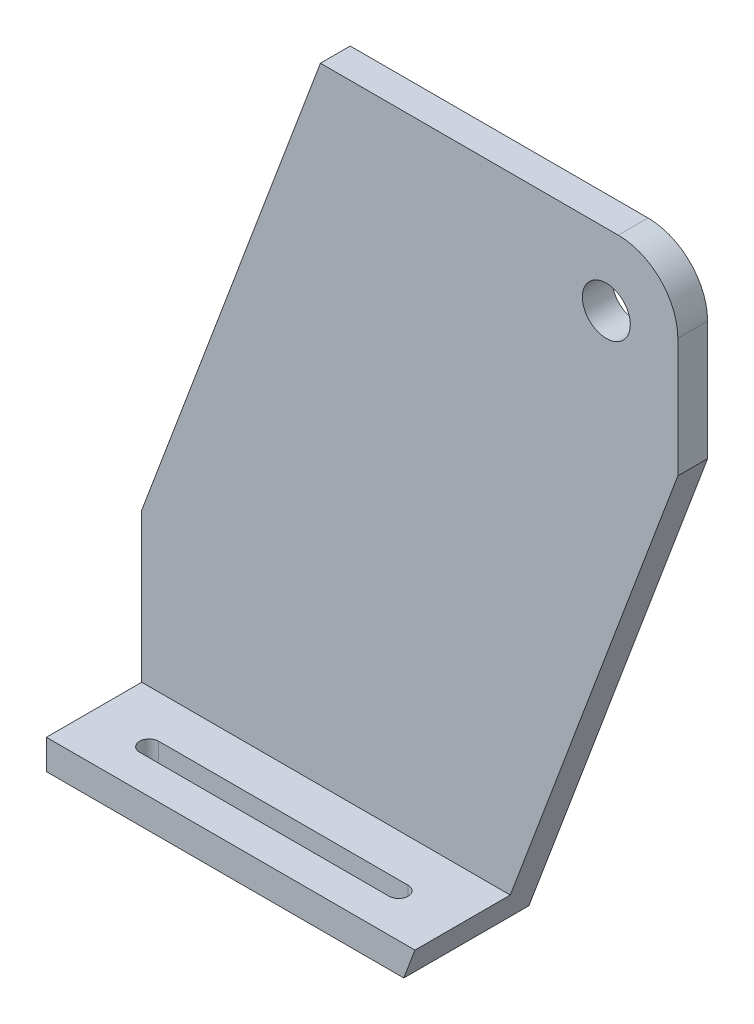
ISO-10303-21;
HEADER;
FILE_DESCRIPTION(('STEP AP214'),'2;1');
FILE_NAME('part.step','',(''),(''),'','','');
FILE_SCHEMA(('AUTOMOTIVE_DESIGN { 1 0 10303 214 1 1 1 1 }'));
ENDSEC;
DATA;
#1=APPLICATION_CONTEXT('core data for automotive mechanical design processes');
#2=APPLICATION_PROTOCOL_DEFINITION('international standard','automotive_design',2000,#1);
#3=PRODUCT_CONTEXT('',#1,'mechanical');
#4=PRODUCT('Part','Part','',(#3));
#5=PRODUCT_RELATED_PRODUCT_CATEGORY('part','',(#4));
#6=PRODUCT_DEFINITION_FORMATION('','',#4);
#7=PRODUCT_DEFINITION_CONTEXT('part definition',#1,'design');
#8=PRODUCT_DEFINITION('design','',#6,#7);
#9=PRODUCT_DEFINITION_SHAPE('','',#8);
#10=(LENGTH_UNIT() NAMED_UNIT(*) SI_UNIT(.MILLI.,.METRE.));
#11=(NAMED_UNIT(*) PLANE_ANGLE_UNIT() SI_UNIT($,.RADIAN.));
#12=(NAMED_UNIT(*) SI_UNIT($,.STERADIAN.) SOLID_ANGLE_UNIT());
#13=UNCERTAINTY_MEASURE_WITH_UNIT(LENGTH_MEASURE(1.E-05),#10,'distance_accuracy_value','');
#14=(GEOMETRIC_REPRESENTATION_CONTEXT(3) GLOBAL_UNCERTAINTY_ASSIGNED_CONTEXT((#13)) GLOBAL_UNIT_ASSIGNED_CONTEXT((#10,
#11,#12)) REPRESENTATION_CONTEXT('',''));
#15=CARTESIAN_POINT('',(0.,0.,0.));
#16=DIRECTION('',(0.,0.,1.));
#17=DIRECTION('',(1.,0.,0.));
#18=AXIS2_PLACEMENT_3D('',#15,#16,#17);
#19=CARTESIAN_POINT('',(-45.,2.5,21.));
#20=DIRECTION('',(0.,-1.,0.));
#21=DIRECTION('',(0.,0.,-1.));
#22=AXIS2_PLACEMENT_3D('',#19,#20,#21);
#23=PLANE('',#22);
#24=DIRECTION('',(-1.,0.,0.));
#25=VECTOR('',#24,1.);
#26=CARTESIAN_POINT('',(6.87499999999999,2.5,12.15));
#27=LINE('',#26,#25);
#28=CARTESIAN_POINT('',(6.87499999999999,2.5,12.15));
#29=VERTEX_POINT('',#28);
#30=CARTESIAN_POINT('',(-35.,2.5,12.15));
#31=VERTEX_POINT('',#30);
#32=EDGE_CURVE('E152',#29,#31,#27,.T.);
#33=ORIENTED_EDGE('',*,*,#32,.F.);
#34=CARTESIAN_POINT('',(6.87499999999999,2.5,13.75));
#35=DIRECTION('',(0.,1.,0.));
#36=DIRECTION('',(0.,0.,1.));
#37=AXIS2_PLACEMENT_3D('',#34,#35,#36);
#38=CIRCLE('',#37,1.6);
#39=CARTESIAN_POINT('',(6.87499999999999,2.5,15.35));
#40=VERTEX_POINT('',#39);
#41=EDGE_CURVE('E60',#40,#29,#38,.T.);
#42=ORIENTED_EDGE('',*,*,#41,.F.);
#43=DIRECTION('',(1.,0.,0.));
#44=VECTOR('',#43,1.);
#45=CARTESIAN_POINT('',(6.87499999999999,2.5,15.35));
#46=LINE('',#45,#44);
#47=CARTESIAN_POINT('',(-35.,2.5,15.35));
#48=VERTEX_POINT('',#47);
#49=EDGE_CURVE('E158',#48,#40,#46,.T.);
#50=ORIENTED_EDGE('',*,*,#49,.F.);
#51=CARTESIAN_POINT('',(-35.,2.5,13.75));
#52=DIRECTION('',(0.,1.,0.));
#53=DIRECTION('',(0.,0.,1.));
#54=AXIS2_PLACEMENT_3D('',#51,#52,#53);
#55=CIRCLE('',#54,1.6);
#56=EDGE_CURVE('E143',#31,#48,#55,.T.);
#57=ORIENTED_EDGE('',*,*,#56,.F.);
#58=EDGE_LOOP('',(#33,#42,#50,#57));
#59=FACE_BOUND('',#58,.T.);
#60=DIRECTION('',(-1.,0.,0.));
#61=VECTOR('',#60,1.);
#62=CARTESIAN_POINT('',(-45.,2.5,21.));
#63=LINE('',#62,#61);
#64=CARTESIAN_POINT('',(16.875,2.5,21.));
#65=VERTEX_POINT('',#64);
#66=CARTESIAN_POINT('',(-45.,2.5,21.));
#67=VERTEX_POINT('',#66);
#68=EDGE_CURVE('E211',#65,#67,#63,.T.);
#69=ORIENTED_EDGE('',*,*,#68,.F.);
#70=DIRECTION('',(0.,0.,-1.));
#71=VECTOR('',#70,1.);
#72=CARTESIAN_POINT('',(16.875,2.5,21.));
#73=LINE('',#72,#71);
#74=CARTESIAN_POINT('',(16.875,2.49999999999999,5.));
#75=VERTEX_POINT('',#74);
#76=EDGE_CURVE('E188',#65,#75,#73,.T.);
#77=ORIENTED_EDGE('',*,*,#76,.T.);
#78=DIRECTION('',(1.,0.,0.));
#79=VECTOR('',#78,1.);
#80=CARTESIAN_POINT('',(-45.,2.5,5.));
#81=LINE('',#80,#79);
#82=CARTESIAN_POINT('',(-45.,2.5,5.00000000000001));
#83=VERTEX_POINT('',#82);
#84=EDGE_CURVE('E195',#83,#75,#81,.T.);
#85=ORIENTED_EDGE('',*,*,#84,.F.);
#86=DIRECTION('',(0.,0.,-1.));
#87=VECTOR('',#86,1.);
#88=CARTESIAN_POINT('',(-45.,2.5,21.));
#89=LINE('',#88,#87);
#90=EDGE_CURVE('E227',#67,#83,#89,.T.);
#91=ORIENTED_EDGE('',*,*,#90,.F.);
#92=EDGE_LOOP('',(#69,#77,#85,#91));
#93=FACE_BOUND('',#92,.T.);
#94=ADVANCED_FACE('F45',(#59,#93),#23,.F.);
#95=CARTESIAN_POINT('',(45.,2.5,21.));
#96=DIRECTION('',(-1.,0.,0.));
#97=DIRECTION('',(0.,0.,1.));
#98=AXIS2_PLACEMENT_3D('',#95,#96,#97);
#99=PLANE('',#98);
#100=DIRECTION('',(0.,-1.,0.));
#101=VECTOR('',#100,1.);
#102=CARTESIAN_POINT('',(45.,107.5,5.));
#103=LINE('',#102,#101);
#104=CARTESIAN_POINT('',(45.,97.5,5.));
#105=VERTEX_POINT('',#104);
#106=CARTESIAN_POINT('',(45.,77.5,5.));
#107=VERTEX_POINT('',#106);
#108=EDGE_CURVE('E203',#105,#107,#103,.T.);
#109=ORIENTED_EDGE('',*,*,#108,.T.);
#110=DIRECTION('',(0.,0.,1.));
#111=VECTOR('',#110,1.);
#112=CARTESIAN_POINT('',(45.,77.5,0.));
#113=LINE('',#112,#111);
#114=CARTESIAN_POINT('',(45.,77.5,0.));
#115=VERTEX_POINT('',#114);
#116=EDGE_CURVE('E171',#115,#107,#113,.T.);
#117=ORIENTED_EDGE('',*,*,#116,.F.);
#118=DIRECTION('',(0.,1.,0.));
#119=VECTOR('',#118,1.);
#120=CARTESIAN_POINT('',(45.,2.5,0.));
#121=LINE('',#120,#119);
#122=CARTESIAN_POINT('',(45.,97.5,0.));
#123=VERTEX_POINT('',#122);
#124=EDGE_CURVE('E210',#115,#123,#121,.T.);
#125=ORIENTED_EDGE('',*,*,#124,.T.);
#126=DIRECTION('',(0.,0.,-1.));
#127=VECTOR('',#126,1.);
#128=CARTESIAN_POINT('',(45.,97.5,5.));
#129=LINE('',#128,#127);
#130=EDGE_CURVE('E236',#123,#105,#129,.F.);
#131=ORIENTED_EDGE('',*,*,#130,.T.);
#132=EDGE_LOOP('',(#109,#117,#125,#131));
#133=FACE_BOUND('',#132,.T.);
#134=ADVANCED_FACE('F268',(#133),#99,.F.);
#135=CARTESIAN_POINT('',(-45.,2.5,21.));
#136=DIRECTION('',(1.,0.,0.));
#137=DIRECTION('',(0.,0.,-1.));
#138=AXIS2_PLACEMENT_3D('',#135,#136,#137);
#139=PLANE('',#138);
#140=DIRECTION('',(0.,-1.,0.));
#141=VECTOR('',#140,1.);
#142=CARTESIAN_POINT('',(-45.,107.5,5.));
#143=LINE('',#142,#141);
#144=CARTESIAN_POINT('',(-45.,27.5,5.));
#145=VERTEX_POINT('',#144);
#146=EDGE_CURVE('E208',#145,#83,#143,.T.);
#147=ORIENTED_EDGE('',*,*,#146,.F.);
#148=DIRECTION('',(0.,0.,1.));
#149=VECTOR('',#148,1.);
#150=CARTESIAN_POINT('',(-45.,27.5,0.));
#151=LINE('',#150,#149);
#152=CARTESIAN_POINT('',(-45.,27.5,0.));
#153=VERTEX_POINT('',#152);
#154=EDGE_CURVE('E180',#153,#145,#151,.T.);
#155=ORIENTED_EDGE('',*,*,#154,.F.);
#156=DIRECTION('',(0.,-1.,0.));
#157=VECTOR('',#156,1.);
#158=CARTESIAN_POINT('',(-45.,2.5,0.));
#159=LINE('',#158,#157);
#160=CARTESIAN_POINT('',(-45.,-2.5,0.));
#161=VERTEX_POINT('',#160);
#162=EDGE_CURVE('E221',#153,#161,#159,.T.);
#163=ORIENTED_EDGE('',*,*,#162,.T.);
#164=DIRECTION('',(0.,0.,-1.));
#165=VECTOR('',#164,1.);
#166=CARTESIAN_POINT('',(-45.,-2.5,21.));
#167=LINE('',#166,#165);
#168=CARTESIAN_POINT('',(-45.,-2.5,21.));
#169=VERTEX_POINT('',#168);
#170=EDGE_CURVE('E219',#169,#161,#167,.T.);
#171=ORIENTED_EDGE('',*,*,#170,.F.);
#172=DIRECTION('',(0.,-1.,0.));
#173=VECTOR('',#172,1.);
#174=CARTESIAN_POINT('',(-45.,2.5,21.));
#175=LINE('',#174,#173);
#176=EDGE_CURVE('E213',#67,#169,#175,.T.);
#177=ORIENTED_EDGE('',*,*,#176,.F.);
#178=ORIENTED_EDGE('',*,*,#90,.T.);
#179=EDGE_LOOP('',(#147,#155,#163,#171,#177,#178));
#180=FACE_BOUND('',#179,.T.);
#181=ADVANCED_FACE('F273',(#180),#139,.F.);
#182=CARTESIAN_POINT('',(-45.,-2.5,21.));
#183=DIRECTION('',(0.,1.,0.));
#184=DIRECTION('',(0.,0.,1.));
#185=AXIS2_PLACEMENT_3D('',#182,#183,#184);
#186=PLANE('',#185);
#187=DIRECTION('',(1.,0.,0.));
#188=VECTOR('',#187,1.);
#189=CARTESIAN_POINT('',(-45.,-2.5,15.35));
#190=LINE('',#189,#188);
#191=CARTESIAN_POINT('',(-35.,-2.5,15.35));
#192=VERTEX_POINT('',#191);
#193=CARTESIAN_POINT('',(6.87499999999999,-2.5,15.35));
#194=VERTEX_POINT('',#193);
#195=EDGE_CURVE('E53',#192,#194,#190,.T.);
#196=ORIENTED_EDGE('',*,*,#195,.T.);
#197=CARTESIAN_POINT('',(6.87499999999999,-2.5,13.75));
#198=DIRECTION('',(0.,1.,0.));
#199=DIRECTION('',(0.,0.,1.));
#200=AXIS2_PLACEMENT_3D('',#197,#198,#199);
#201=CIRCLE('',#200,1.6);
#202=CARTESIAN_POINT('',(6.87499999999999,-2.5,12.15));
#203=VERTEX_POINT('',#202);
#204=EDGE_CURVE('E11',#194,#203,#201,.T.);
#205=ORIENTED_EDGE('',*,*,#204,.T.);
#206=DIRECTION('',(-1.,0.,0.));
#207=VECTOR('',#206,1.);
#208=CARTESIAN_POINT('',(-45.,-2.5,12.15));
#209=LINE('',#208,#207);
#210=CARTESIAN_POINT('',(-35.,-2.5,12.15));
#211=VERTEX_POINT('',#210);
#212=EDGE_CURVE('E244',#203,#211,#209,.T.);
#213=ORIENTED_EDGE('',*,*,#212,.T.);
#214=CARTESIAN_POINT('',(-35.,-2.5,13.75));
#215=DIRECTION('',(0.,1.,0.));
#216=DIRECTION('',(0.,0.,1.));
#217=AXIS2_PLACEMENT_3D('',#214,#215,#216);
#218=CIRCLE('',#217,1.6);
#219=EDGE_CURVE('E146',#211,#192,#218,.T.);
#220=ORIENTED_EDGE('',*,*,#219,.T.);
#221=EDGE_LOOP('',(#196,#205,#213,#220));
#222=FACE_BOUND('',#221,.T.);
#223=DIRECTION('',(1.,0.,0.));
#224=VECTOR('',#223,1.);
#225=CARTESIAN_POINT('',(-45.,-2.5,0.));
#226=LINE('',#225,#224);
#227=CARTESIAN_POINT('',(15.,-2.5,0.));
#228=VERTEX_POINT('',#227);
#229=EDGE_CURVE('E214',#161,#228,#226,.T.);
#230=ORIENTED_EDGE('',*,*,#229,.T.);
#231=DIRECTION('',(0.,0.,1.));
#232=VECTOR('',#231,1.);
#233=CARTESIAN_POINT('',(15.,-2.5,0.));
#234=LINE('',#233,#232);
#235=CARTESIAN_POINT('',(15.,-2.5,21.));
#236=VERTEX_POINT('',#235);
#237=EDGE_CURVE('E175',#228,#236,#234,.T.);
#238=ORIENTED_EDGE('',*,*,#237,.T.);
#239=DIRECTION('',(1.,0.,0.));
#240=VECTOR('',#239,1.);
#241=CARTESIAN_POINT('',(-45.,-2.5,21.));
#242=LINE('',#241,#240);
#243=EDGE_CURVE('E216',#169,#236,#242,.T.);
#244=ORIENTED_EDGE('',*,*,#243,.F.);
#245=ORIENTED_EDGE('',*,*,#170,.T.);
#246=EDGE_LOOP('',(#230,#238,#244,#245));
#247=FACE_BOUND('',#246,.T.);
#248=ADVANCED_FACE('F248',(#222,#247),#186,.F.);
#249=CARTESIAN_POINT('',(0.,0.,21.));
#250=DIRECTION('',(0.,0.,1.));
#251=DIRECTION('',(1.,0.,0.));
#252=AXIS2_PLACEMENT_3D('',#249,#250,#251);
#253=PLANE('',#252);
#254=DIRECTION('',(-0.351123441588392,-0.936329177569045,0.));
#255=VECTOR('',#254,1.);
#256=CARTESIAN_POINT('',(45.,77.5,21.));
#257=LINE('',#256,#255);
#258=EDGE_CURVE('E172',#65,#236,#257,.T.);
#259=ORIENTED_EDGE('',*,*,#258,.F.);
#260=ORIENTED_EDGE('',*,*,#68,.T.);
#261=ORIENTED_EDGE('',*,*,#176,.T.);
#262=ORIENTED_EDGE('',*,*,#243,.T.);
#263=EDGE_LOOP('',(#259,#260,#261,#262));
#264=FACE_BOUND('',#263,.T.);
#265=ADVANCED_FACE('F280',(#264),#253,.T.);
#266=CARTESIAN_POINT('',(0.,0.,0.));
#267=DIRECTION('',(0.,0.,1.));
#268=DIRECTION('',(1.,0.,0.));
#269=AXIS2_PLACEMENT_3D('',#266,#267,#268);
#270=PLANE('',#269);
#271=CARTESIAN_POINT('',(33.,95.5,0.));
#272=DIRECTION('',(0.,0.,1.));
#273=DIRECTION('',(1.,0.,0.));
#274=AXIS2_PLACEMENT_3D('',#271,#272,#273);
#275=CIRCLE('',#274,4.025);
#276=CARTESIAN_POINT('',(37.025,95.5,0.));
#277=VERTEX_POINT('',#276);
#278=EDGE_CURVE('E192',#277,#277,#275,.T.);
#279=ORIENTED_EDGE('',*,*,#278,.T.);
#280=EDGE_LOOP('',(#279));
#281=FACE_BOUND('',#280,.T.);
#282=ORIENTED_EDGE('',*,*,#124,.F.);
#283=DIRECTION('',(-0.351123441588392,-0.936329177569045,0.));
#284=VECTOR('',#283,1.);
#285=CARTESIAN_POINT('',(45.,77.5,0.));
#286=LINE('',#285,#284);
#287=EDGE_CURVE('E168',#115,#228,#286,.T.);
#288=ORIENTED_EDGE('',*,*,#287,.T.);
#289=ORIENTED_EDGE('',*,*,#229,.F.);
#290=ORIENTED_EDGE('',*,*,#162,.F.);
#291=DIRECTION('',(0.351123441588391,0.936329177569045,0.));
#292=VECTOR('',#291,1.);
#293=CARTESIAN_POINT('',(-45.,27.5,0.));
#294=LINE('',#293,#292);
#295=CARTESIAN_POINT('',(-15.,107.5,0.));
#296=VERTEX_POINT('',#295);
#297=EDGE_CURVE('E174',#153,#296,#294,.T.);
#298=ORIENTED_EDGE('',*,*,#297,.T.);
#299=DIRECTION('',(-1.,0.,0.));
#300=VECTOR('',#299,1.);
#301=CARTESIAN_POINT('',(-45.,107.5,0.));
#302=LINE('',#301,#300);
#303=CARTESIAN_POINT('',(35.,107.5,0.));
#304=VERTEX_POINT('',#303);
#305=EDGE_CURVE('E200',#304,#296,#302,.T.);
#306=ORIENTED_EDGE('',*,*,#305,.F.);
#307=CARTESIAN_POINT('',(35.,97.5,0.));
#308=DIRECTION('',(0.,0.,1.));
#309=DIRECTION('',(1.,0.,0.));
#310=AXIS2_PLACEMENT_3D('',#307,#308,#309);
#311=CIRCLE('',#310,10.);
#312=EDGE_CURVE('E233',#304,#123,#311,.F.);
#313=ORIENTED_EDGE('',*,*,#312,.T.);
#314=EDGE_LOOP('',(#282,#288,#289,#290,#298,#306,#313));
#315=FACE_BOUND('',#314,.T.);
#316=ADVANCED_FACE('F281',(#281,#315),#270,.F.);
#317=CARTESIAN_POINT('',(-45.,107.5,5.));
#318=DIRECTION('',(0.,0.,-1.));
#319=DIRECTION('',(-1.,0.,0.));
#320=AXIS2_PLACEMENT_3D('',#317,#318,#319);
#321=PLANE('',#320);
#322=CARTESIAN_POINT('',(33.,95.5,5.));
#323=DIRECTION('',(0.,0.,1.));
#324=DIRECTION('',(1.,0.,0.));
#325=AXIS2_PLACEMENT_3D('',#322,#323,#324);
#326=CIRCLE('',#325,4.025);
#327=CARTESIAN_POINT('',(37.025,95.5,5.));
#328=VERTEX_POINT('',#327);
#329=EDGE_CURVE('E191',#328,#328,#326,.T.);
#330=ORIENTED_EDGE('',*,*,#329,.F.);
#331=EDGE_LOOP('',(#330));
#332=FACE_BOUND('',#331,.T.);
#333=ORIENTED_EDGE('',*,*,#84,.T.);
#334=DIRECTION('',(0.351123441588392,0.936329177569045,0.));
#335=VECTOR('',#334,1.);
#336=CARTESIAN_POINT('',(43.7671232876712,74.2123287671233,5.));
#337=LINE('',#336,#335);
#338=EDGE_CURVE('E241',#75,#107,#337,.T.);
#339=ORIENTED_EDGE('',*,*,#338,.T.);
#340=ORIENTED_EDGE('',*,*,#108,.F.);
#341=CARTESIAN_POINT('',(35.,97.5,5.));
#342=DIRECTION('',(0.,0.,-1.));
#343=DIRECTION('',(-1.,0.,0.));
#344=AXIS2_PLACEMENT_3D('',#341,#342,#343);
#345=CIRCLE('',#344,10.);
#346=CARTESIAN_POINT('',(35.,107.5,5.));
#347=VERTEX_POINT('',#346);
#348=EDGE_CURVE('E238',#105,#347,#345,.F.);
#349=ORIENTED_EDGE('',*,*,#348,.T.);
#350=DIRECTION('',(1.,0.,0.));
#351=VECTOR('',#350,1.);
#352=CARTESIAN_POINT('',(-45.,107.5,5.));
#353=LINE('',#352,#351);
#354=CARTESIAN_POINT('',(-15.,107.5,5.));
#355=VERTEX_POINT('',#354);
#356=EDGE_CURVE('E198',#355,#347,#353,.T.);
#357=ORIENTED_EDGE('',*,*,#356,.F.);
#358=DIRECTION('',(-0.351123441588391,-0.936329177569045,0.));
#359=VECTOR('',#358,1.);
#360=CARTESIAN_POINT('',(-18.6986301369863,97.6369863013699,5.));
#361=LINE('',#360,#359);
#362=EDGE_CURVE('E178',#355,#145,#361,.T.);
#363=ORIENTED_EDGE('',*,*,#362,.T.);
#364=ORIENTED_EDGE('',*,*,#146,.T.);
#365=EDGE_LOOP('',(#333,#339,#340,#349,#357,#363,#364));
#366=FACE_BOUND('',#365,.T.);
#367=ADVANCED_FACE('F284',(#332,#366),#321,.F.);
#368=CARTESIAN_POINT('',(0.,107.5,0.));
#369=DIRECTION('',(0.,1.,0.));
#370=DIRECTION('',(0.,0.,1.));
#371=AXIS2_PLACEMENT_3D('',#368,#369,#370);
#372=PLANE('',#371);
#373=DIRECTION('',(0.,0.,1.));
#374=VECTOR('',#373,1.);
#375=CARTESIAN_POINT('',(-15.,107.5,0.));
#376=LINE('',#375,#374);
#377=EDGE_CURVE('E165',#296,#355,#376,.T.);
#378=ORIENTED_EDGE('',*,*,#377,.T.);
#379=ORIENTED_EDGE('',*,*,#356,.T.);
#380=DIRECTION('',(0.,0.,-1.));
#381=VECTOR('',#380,1.);
#382=CARTESIAN_POINT('',(35.,107.5,0.));
#383=LINE('',#382,#381);
#384=EDGE_CURVE('E230',#347,#304,#383,.T.);
#385=ORIENTED_EDGE('',*,*,#384,.T.);
#386=ORIENTED_EDGE('',*,*,#305,.T.);
#387=EDGE_LOOP('',(#378,#379,#385,#386));
#388=FACE_BOUND('',#387,.T.);
#389=ADVANCED_FACE('F291',(#388),#372,.T.);
#390=CARTESIAN_POINT('',(35.,97.5,0.));
#391=DIRECTION('',(0.,0.,1.));
#392=DIRECTION('',(1.,0.,0.));
#393=AXIS2_PLACEMENT_3D('',#390,#391,#392);
#394=CYLINDRICAL_SURFACE('',#393,10.);
#395=ORIENTED_EDGE('',*,*,#348,.F.);
#396=ORIENTED_EDGE('',*,*,#130,.F.);
#397=ORIENTED_EDGE('',*,*,#312,.F.);
#398=ORIENTED_EDGE('',*,*,#384,.F.);
#399=EDGE_LOOP('',(#395,#396,#397,#398));
#400=FACE_BOUND('',#399,.T.);
#401=ADVANCED_FACE('F47',(#400),#394,.T.);
#402=CARTESIAN_POINT('',(33.,95.5,0.));
#403=DIRECTION('',(0.,0.,1.));
#404=DIRECTION('',(1.,0.,0.));
#405=AXIS2_PLACEMENT_3D('',#402,#403,#404);
#406=CYLINDRICAL_SURFACE('',#405,4.025);
#407=ORIENTED_EDGE('',*,*,#278,.F.);
#408=EDGE_LOOP('',(#407));
#409=FACE_BOUND('',#408,.T.);
#410=ORIENTED_EDGE('',*,*,#329,.T.);
#411=EDGE_LOOP('',(#410));
#412=FACE_BOUND('',#411,.T.);
#413=ADVANCED_FACE('F296',(#409,#412),#406,.F.);
#414=CARTESIAN_POINT('',(-45.,27.5,0.));
#415=DIRECTION('',(0.936329177569044,-0.351123441588391,0.));
#416=DIRECTION('',(0.351123441588391,0.936329177569045,0.));
#417=AXIS2_PLACEMENT_3D('',#414,#415,#416);
#418=PLANE('',#417);
#419=ORIENTED_EDGE('',*,*,#377,.F.);
#420=ORIENTED_EDGE('',*,*,#297,.F.);
#421=ORIENTED_EDGE('',*,*,#154,.T.);
#422=ORIENTED_EDGE('',*,*,#362,.F.);
#423=EDGE_LOOP('',(#419,#420,#421,#422));
#424=FACE_BOUND('',#423,.T.);
#425=ADVANCED_FACE('F263',(#424),#418,.F.);
#426=CARTESIAN_POINT('',(45.,77.5,0.));
#427=DIRECTION('',(-0.936329177569044,0.351123441588392,0.));
#428=DIRECTION('',(-0.351123441588392,-0.936329177569045,0.));
#429=AXIS2_PLACEMENT_3D('',#426,#427,#428);
#430=PLANE('',#429);
#431=ORIENTED_EDGE('',*,*,#258,.T.);
#432=ORIENTED_EDGE('',*,*,#237,.F.);
#433=ORIENTED_EDGE('',*,*,#287,.F.);
#434=ORIENTED_EDGE('',*,*,#116,.T.);
#435=ORIENTED_EDGE('',*,*,#338,.F.);
#436=ORIENTED_EDGE('',*,*,#76,.F.);
#437=EDGE_LOOP('',(#431,#432,#433,#434,#435,#436));
#438=FACE_BOUND('',#437,.T.);
#439=ADVANCED_FACE('F255',(#438),#430,.F.);
#440=CARTESIAN_POINT('',(6.87499999999999,-7.5,13.75));
#441=DIRECTION('',(0.,1.,0.));
#442=DIRECTION('',(0.,0.,1.));
#443=AXIS2_PLACEMENT_3D('',#440,#441,#442);
#444=CYLINDRICAL_SURFACE('',#443,1.6);
#445=DIRECTION('',(0.,1.,0.));
#446=VECTOR('',#445,1.);
#447=CARTESIAN_POINT('',(6.87499999999999,-7.5,15.35));
#448=LINE('',#447,#446);
#449=EDGE_CURVE('E163',#194,#40,#448,.T.);
#450=ORIENTED_EDGE('',*,*,#449,.T.);
#451=ORIENTED_EDGE('',*,*,#41,.T.);
#452=DIRECTION('',(0.,1.,0.));
#453=VECTOR('',#452,1.);
#454=CARTESIAN_POINT('',(6.87499999999999,-7.5,12.15));
#455=LINE('',#454,#453);
#456=EDGE_CURVE('E149',#203,#29,#455,.T.);
#457=ORIENTED_EDGE('',*,*,#456,.F.);
#458=ORIENTED_EDGE('',*,*,#204,.F.);
#459=EDGE_LOOP('',(#450,#451,#457,#458));
#460=FACE_BOUND('',#459,.T.);
#461=ADVANCED_FACE('F253',(#460),#444,.F.);
#462=CARTESIAN_POINT('',(6.87499999999999,-7.5,15.35));
#463=DIRECTION('',(0.,0.,1.));
#464=DIRECTION('',(1.,0.,0.));
#465=AXIS2_PLACEMENT_3D('',#462,#463,#464);
#466=PLANE('',#465);
#467=DIRECTION('',(0.,1.,0.));
#468=VECTOR('',#467,1.);
#469=CARTESIAN_POINT('',(-35.,-7.5,15.35));
#470=LINE('',#469,#468);
#471=EDGE_CURVE('E148',#192,#48,#470,.T.);
#472=ORIENTED_EDGE('',*,*,#471,.T.);
#473=ORIENTED_EDGE('',*,*,#49,.T.);
#474=ORIENTED_EDGE('',*,*,#449,.F.);
#475=ORIENTED_EDGE('',*,*,#195,.F.);
#476=EDGE_LOOP('',(#472,#473,#474,#475));
#477=FACE_BOUND('',#476,.T.);
#478=ADVANCED_FACE('F252',(#477),#466,.F.);
#479=CARTESIAN_POINT('',(-35.,-7.5,13.75));
#480=DIRECTION('',(0.,1.,0.));
#481=DIRECTION('',(0.,0.,1.));
#482=AXIS2_PLACEMENT_3D('',#479,#480,#481);
#483=CYLINDRICAL_SURFACE('',#482,1.6);
#484=DIRECTION('',(0.,1.,0.));
#485=VECTOR('',#484,1.);
#486=CARTESIAN_POINT('',(-35.,-7.5,12.15));
#487=LINE('',#486,#485);
#488=EDGE_CURVE('E68',#211,#31,#487,.T.);
#489=ORIENTED_EDGE('',*,*,#488,.T.);
#490=ORIENTED_EDGE('',*,*,#56,.T.);
#491=ORIENTED_EDGE('',*,*,#471,.F.);
#492=ORIENTED_EDGE('',*,*,#219,.F.);
#493=EDGE_LOOP('',(#489,#490,#491,#492));
#494=FACE_BOUND('',#493,.T.);
#495=ADVANCED_FACE('F140',(#494),#483,.F.);
#496=CARTESIAN_POINT('',(6.87499999999999,-7.5,12.15));
#497=DIRECTION('',(0.,0.,-1.));
#498=DIRECTION('',(-1.,0.,0.));
#499=AXIS2_PLACEMENT_3D('',#496,#497,#498);
#500=PLANE('',#499);
#501=ORIENTED_EDGE('',*,*,#456,.T.);
#502=ORIENTED_EDGE('',*,*,#32,.T.);
#503=ORIENTED_EDGE('',*,*,#488,.F.);
#504=ORIENTED_EDGE('',*,*,#212,.F.);
#505=EDGE_LOOP('',(#501,#502,#503,#504));
#506=FACE_BOUND('',#505,.T.);
#507=ADVANCED_FACE('F153',(#506),#500,.F.);
#508=CLOSED_SHELL('',(#94,#134,#181,#248,#265,#316,#367,#389,#401,#413,#425,#439,#461,#478,#495,#507));
#509=MANIFOLD_SOLID_BREP('B2',#508);
#510=ADVANCED_BREP_SHAPE_REPRESENTATION('',(#18,#509),#14);
#511=SHAPE_DEFINITION_REPRESENTATION(#9,#510);
ENDSEC;
END-ISO-10303-21;
